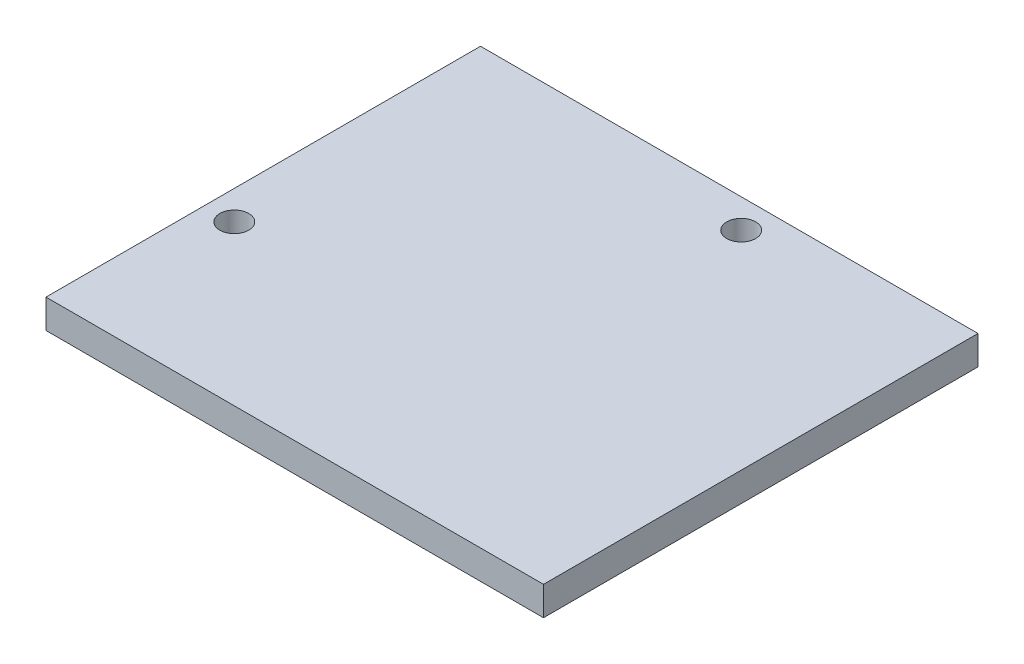
ISO-10303-21;
HEADER;
FILE_DESCRIPTION(('STEP AP214'),'2;1');
FILE_NAME('part.step','',(''),(''),'','','');
FILE_SCHEMA(('AUTOMOTIVE_DESIGN { 1 0 10303 214 1 1 1 1 }'));
ENDSEC;
DATA;
#1=APPLICATION_CONTEXT('core data for automotive mechanical design processes');
#2=APPLICATION_PROTOCOL_DEFINITION('international standard','automotive_design',2000,#1);
#3=PRODUCT_CONTEXT('',#1,'mechanical');
#4=PRODUCT('Part','Part','',(#3));
#5=PRODUCT_RELATED_PRODUCT_CATEGORY('part','',(#4));
#6=PRODUCT_DEFINITION_FORMATION('','',#4);
#7=PRODUCT_DEFINITION_CONTEXT('part definition',#1,'design');
#8=PRODUCT_DEFINITION('design','',#6,#7);
#9=PRODUCT_DEFINITION_SHAPE('','',#8);
#10=(LENGTH_UNIT() NAMED_UNIT(*) SI_UNIT(.MILLI.,.METRE.));
#11=(NAMED_UNIT(*) PLANE_ANGLE_UNIT() SI_UNIT($,.RADIAN.));
#12=(NAMED_UNIT(*) SI_UNIT($,.STERADIAN.) SOLID_ANGLE_UNIT());
#13=UNCERTAINTY_MEASURE_WITH_UNIT(LENGTH_MEASURE(1.E-05),#10,'distance_accuracy_value','');
#14=(GEOMETRIC_REPRESENTATION_CONTEXT(3) GLOBAL_UNCERTAINTY_ASSIGNED_CONTEXT((#13)) GLOBAL_UNIT_ASSIGNED_CONTEXT((#10,
#11,#12)) REPRESENTATION_CONTEXT('',''));
#15=CARTESIAN_POINT('',(0.,0.,0.));
#16=DIRECTION('',(0.,0.,1.));
#17=DIRECTION('',(1.,0.,0.));
#18=AXIS2_PLACEMENT_3D('',#15,#16,#17);
#19=CARTESIAN_POINT('',(0.,2.54,0.));
#20=DIRECTION('',(0.,-1.,0.));
#21=DIRECTION('',(0.,0.,-1.));
#22=AXIS2_PLACEMENT_3D('',#19,#20,#21);
#23=PLANE('',#22);
#24=DIRECTION('',(0.,0.,1.));
#25=VECTOR('',#24,1.);
#26=CARTESIAN_POINT('',(0.,2.54,38.1));
#27=LINE('',#26,#25);
#28=CARTESIAN_POINT('',(0.,2.54,0.));
#29=VERTEX_POINT('',#28);
#30=CARTESIAN_POINT('',(0.,2.54,38.1));
#31=VERTEX_POINT('',#30);
#32=EDGE_CURVE('E85',#29,#31,#27,.T.);
#33=ORIENTED_EDGE('',*,*,#32,.T.);
#34=DIRECTION('',(1.,0.,0.));
#35=VECTOR('',#34,1.);
#36=CARTESIAN_POINT('',(0.,2.54,38.1));
#37=LINE('',#36,#35);
#38=CARTESIAN_POINT('',(43.6245,2.54,38.1));
#39=VERTEX_POINT('',#38);
#40=EDGE_CURVE('E80',#31,#39,#37,.T.);
#41=ORIENTED_EDGE('',*,*,#40,.T.);
#42=DIRECTION('',(0.,0.,-1.));
#43=VECTOR('',#42,1.);
#44=CARTESIAN_POINT('',(43.6245,2.54,38.1));
#45=LINE('',#44,#43);
#46=CARTESIAN_POINT('',(43.6245,2.54,0.));
#47=VERTEX_POINT('',#46);
#48=EDGE_CURVE('E83',#39,#47,#45,.T.);
#49=ORIENTED_EDGE('',*,*,#48,.T.);
#50=DIRECTION('',(-1.,0.,0.));
#51=VECTOR('',#50,1.);
#52=CARTESIAN_POINT('',(0.,2.54,0.));
#53=LINE('',#52,#51);
#54=EDGE_CURVE('E50',#47,#29,#53,.T.);
#55=ORIENTED_EDGE('',*,*,#54,.T.);
#56=EDGE_LOOP('',(#33,#41,#49,#55));
#57=FACE_BOUND('',#56,.T.);
#58=CARTESIAN_POINT('',(25.4,2.54,2.54));
#59=DIRECTION('',(0.,1.,0.));
#60=DIRECTION('',(0.,0.,1.));
#61=AXIS2_PLACEMENT_3D('',#58,#59,#60);
#62=CIRCLE('',#61,1.27);
#63=CARTESIAN_POINT('',(25.4,2.54,3.81));
#64=VERTEX_POINT('',#63);
#65=EDGE_CURVE('E100',#64,#64,#62,.T.);
#66=ORIENTED_EDGE('',*,*,#65,.F.);
#67=EDGE_LOOP('',(#66));
#68=FACE_BOUND('',#67,.T.);
#69=CARTESIAN_POINT('',(2.54,2.54,24.13));
#70=DIRECTION('',(0.,1.,0.));
#71=DIRECTION('',(0.,0.,1.));
#72=AXIS2_PLACEMENT_3D('',#69,#70,#71);
#73=CIRCLE('',#72,1.27);
#74=CARTESIAN_POINT('',(2.54,2.54,25.4));
#75=VERTEX_POINT('',#74);
#76=EDGE_CURVE('E115',#75,#75,#73,.T.);
#77=ORIENTED_EDGE('',*,*,#76,.F.);
#78=EDGE_LOOP('',(#77));
#79=FACE_BOUND('',#78,.T.);
#80=ADVANCED_FACE('F33',(#57,#68,#79),#23,.F.);
#81=CARTESIAN_POINT('',(0.,0.,0.));
#82=DIRECTION('',(0.,-1.,0.));
#83=DIRECTION('',(0.,0.,-1.));
#84=AXIS2_PLACEMENT_3D('',#81,#82,#83);
#85=PLANE('',#84);
#86=CARTESIAN_POINT('',(25.4,0.,2.54));
#87=DIRECTION('',(0.,1.,0.));
#88=DIRECTION('',(0.,0.,1.));
#89=AXIS2_PLACEMENT_3D('',#86,#87,#88);
#90=CIRCLE('',#89,1.27);
#91=CARTESIAN_POINT('',(25.4,0.,3.81));
#92=VERTEX_POINT('',#91);
#93=EDGE_CURVE('E112',#92,#92,#90,.T.);
#94=ORIENTED_EDGE('',*,*,#93,.T.);
#95=EDGE_LOOP('',(#94));
#96=FACE_BOUND('',#95,.T.);
#97=DIRECTION('',(0.,0.,1.));
#98=VECTOR('',#97,1.);
#99=CARTESIAN_POINT('',(0.,0.,38.1));
#100=LINE('',#99,#98);
#101=CARTESIAN_POINT('',(0.,0.,0.));
#102=VERTEX_POINT('',#101);
#103=CARTESIAN_POINT('',(0.,0.,38.1));
#104=VERTEX_POINT('',#103);
#105=EDGE_CURVE('E97',#102,#104,#100,.T.);
#106=ORIENTED_EDGE('',*,*,#105,.F.);
#107=DIRECTION('',(-1.,0.,0.));
#108=VECTOR('',#107,1.);
#109=CARTESIAN_POINT('',(0.,0.,0.));
#110=LINE('',#109,#108);
#111=CARTESIAN_POINT('',(43.6245,0.,0.));
#112=VERTEX_POINT('',#111);
#113=EDGE_CURVE('E73',#112,#102,#110,.T.);
#114=ORIENTED_EDGE('',*,*,#113,.F.);
#115=DIRECTION('',(0.,0.,-1.));
#116=VECTOR('',#115,1.);
#117=CARTESIAN_POINT('',(43.6245,0.,38.1));
#118=LINE('',#117,#116);
#119=CARTESIAN_POINT('',(43.6245,0.,38.1));
#120=VERTEX_POINT('',#119);
#121=EDGE_CURVE('E67',#120,#112,#118,.T.);
#122=ORIENTED_EDGE('',*,*,#121,.F.);
#123=DIRECTION('',(1.,0.,0.));
#124=VECTOR('',#123,1.);
#125=CARTESIAN_POINT('',(0.,0.,38.1));
#126=LINE('',#125,#124);
#127=EDGE_CURVE('E89',#104,#120,#126,.T.);
#128=ORIENTED_EDGE('',*,*,#127,.F.);
#129=EDGE_LOOP('',(#106,#114,#122,#128));
#130=FACE_BOUND('',#129,.T.);
#131=CARTESIAN_POINT('',(2.54,0.,24.13));
#132=DIRECTION('',(0.,1.,0.));
#133=DIRECTION('',(0.,0.,1.));
#134=AXIS2_PLACEMENT_3D('',#131,#132,#133);
#135=CIRCLE('',#134,1.27);
#136=CARTESIAN_POINT('',(2.54,0.,25.4));
#137=VERTEX_POINT('',#136);
#138=EDGE_CURVE('E118',#137,#137,#135,.T.);
#139=ORIENTED_EDGE('',*,*,#138,.T.);
#140=EDGE_LOOP('',(#139));
#141=FACE_BOUND('',#140,.T.);
#142=ADVANCED_FACE('F108',(#96,#130,#141),#85,.T.);
#143=CARTESIAN_POINT('',(0.,2.54,38.1));
#144=DIRECTION('',(1.,0.,0.));
#145=DIRECTION('',(0.,0.,-1.));
#146=AXIS2_PLACEMENT_3D('',#143,#144,#145);
#147=PLANE('',#146);
#148=ORIENTED_EDGE('',*,*,#105,.T.);
#149=DIRECTION('',(0.,-1.,0.));
#150=VECTOR('',#149,1.);
#151=CARTESIAN_POINT('',(0.,2.54,38.1));
#152=LINE('',#151,#150);
#153=EDGE_CURVE('E11',#31,#104,#152,.T.);
#154=ORIENTED_EDGE('',*,*,#153,.F.);
#155=ORIENTED_EDGE('',*,*,#32,.F.);
#156=DIRECTION('',(0.,-1.,0.));
#157=VECTOR('',#156,1.);
#158=CARTESIAN_POINT('',(0.,2.54,0.));
#159=LINE('',#158,#157);
#160=EDGE_CURVE('E93',#29,#102,#159,.T.);
#161=ORIENTED_EDGE('',*,*,#160,.T.);
#162=EDGE_LOOP('',(#148,#154,#155,#161));
#163=FACE_BOUND('',#162,.T.);
#164=ADVANCED_FACE('F35',(#163),#147,.F.);
#165=CARTESIAN_POINT('',(0.,2.54,38.1));
#166=DIRECTION('',(0.,0.,-1.));
#167=DIRECTION('',(-1.,0.,0.));
#168=AXIS2_PLACEMENT_3D('',#165,#166,#167);
#169=PLANE('',#168);
#170=ORIENTED_EDGE('',*,*,#127,.T.);
#171=DIRECTION('',(0.,-1.,0.));
#172=VECTOR('',#171,1.);
#173=CARTESIAN_POINT('',(43.6245,2.54,38.1));
#174=LINE('',#173,#172);
#175=EDGE_CURVE('E42',#39,#120,#174,.T.);
#176=ORIENTED_EDGE('',*,*,#175,.F.);
#177=ORIENTED_EDGE('',*,*,#40,.F.);
#178=ORIENTED_EDGE('',*,*,#153,.T.);
#179=EDGE_LOOP('',(#170,#176,#177,#178));
#180=FACE_BOUND('',#179,.T.);
#181=ADVANCED_FACE('F88',(#180),#169,.F.);
#182=CARTESIAN_POINT('',(43.6245,2.54,38.1));
#183=DIRECTION('',(-1.,0.,0.));
#184=DIRECTION('',(0.,0.,1.));
#185=AXIS2_PLACEMENT_3D('',#182,#183,#184);
#186=PLANE('',#185);
#187=ORIENTED_EDGE('',*,*,#121,.T.);
#188=DIRECTION('',(0.,-1.,0.));
#189=VECTOR('',#188,1.);
#190=CARTESIAN_POINT('',(43.6245,2.54,0.));
#191=LINE('',#190,#189);
#192=EDGE_CURVE('E90',#47,#112,#191,.T.);
#193=ORIENTED_EDGE('',*,*,#192,.F.);
#194=ORIENTED_EDGE('',*,*,#48,.F.);
#195=ORIENTED_EDGE('',*,*,#175,.T.);
#196=EDGE_LOOP('',(#187,#193,#194,#195));
#197=FACE_BOUND('',#196,.T.);
#198=ADVANCED_FACE('F91',(#197),#186,.F.);
#199=CARTESIAN_POINT('',(0.,2.54,0.));
#200=DIRECTION('',(0.,0.,1.));
#201=DIRECTION('',(1.,0.,0.));
#202=AXIS2_PLACEMENT_3D('',#199,#200,#201);
#203=PLANE('',#202);
#204=ORIENTED_EDGE('',*,*,#113,.T.);
#205=ORIENTED_EDGE('',*,*,#160,.F.);
#206=ORIENTED_EDGE('',*,*,#54,.F.);
#207=ORIENTED_EDGE('',*,*,#192,.T.);
#208=EDGE_LOOP('',(#204,#205,#206,#207));
#209=FACE_BOUND('',#208,.T.);
#210=ADVANCED_FACE('F105',(#209),#203,.F.);
#211=CARTESIAN_POINT('',(25.4,2.54,2.54));
#212=DIRECTION('',(0.,-1.,0.));
#213=DIRECTION('',(0.,0.,-1.));
#214=AXIS2_PLACEMENT_3D('',#211,#212,#213);
#215=CYLINDRICAL_SURFACE('',#214,1.27);
#216=ORIENTED_EDGE('',*,*,#65,.T.);
#217=EDGE_LOOP('',(#216));
#218=FACE_BOUND('',#217,.T.);
#219=ORIENTED_EDGE('',*,*,#93,.F.);
#220=EDGE_LOOP('',(#219));
#221=FACE_BOUND('',#220,.T.);
#222=ADVANCED_FACE('F135',(#218,#221),#215,.F.);
#223=CARTESIAN_POINT('',(2.54,2.54,24.13));
#224=DIRECTION('',(0.,-1.,0.));
#225=DIRECTION('',(0.,0.,-1.));
#226=AXIS2_PLACEMENT_3D('',#223,#224,#225);
#227=CYLINDRICAL_SURFACE('',#226,1.27);
#228=ORIENTED_EDGE('',*,*,#76,.T.);
#229=EDGE_LOOP('',(#228));
#230=FACE_BOUND('',#229,.T.);
#231=ORIENTED_EDGE('',*,*,#138,.F.);
#232=EDGE_LOOP('',(#231));
#233=FACE_BOUND('',#232,.T.);
#234=ADVANCED_FACE('F124',(#230,#233),#227,.F.);
#235=CLOSED_SHELL('',(#80,#142,#164,#181,#198,#210,#222,#234));
#236=MANIFOLD_SOLID_BREP('B2',#235);
#237=ADVANCED_BREP_SHAPE_REPRESENTATION('',(#18,#236),#14);
#238=SHAPE_DEFINITION_REPRESENTATION(#9,#237);
ENDSEC;
END-ISO-10303-21;
